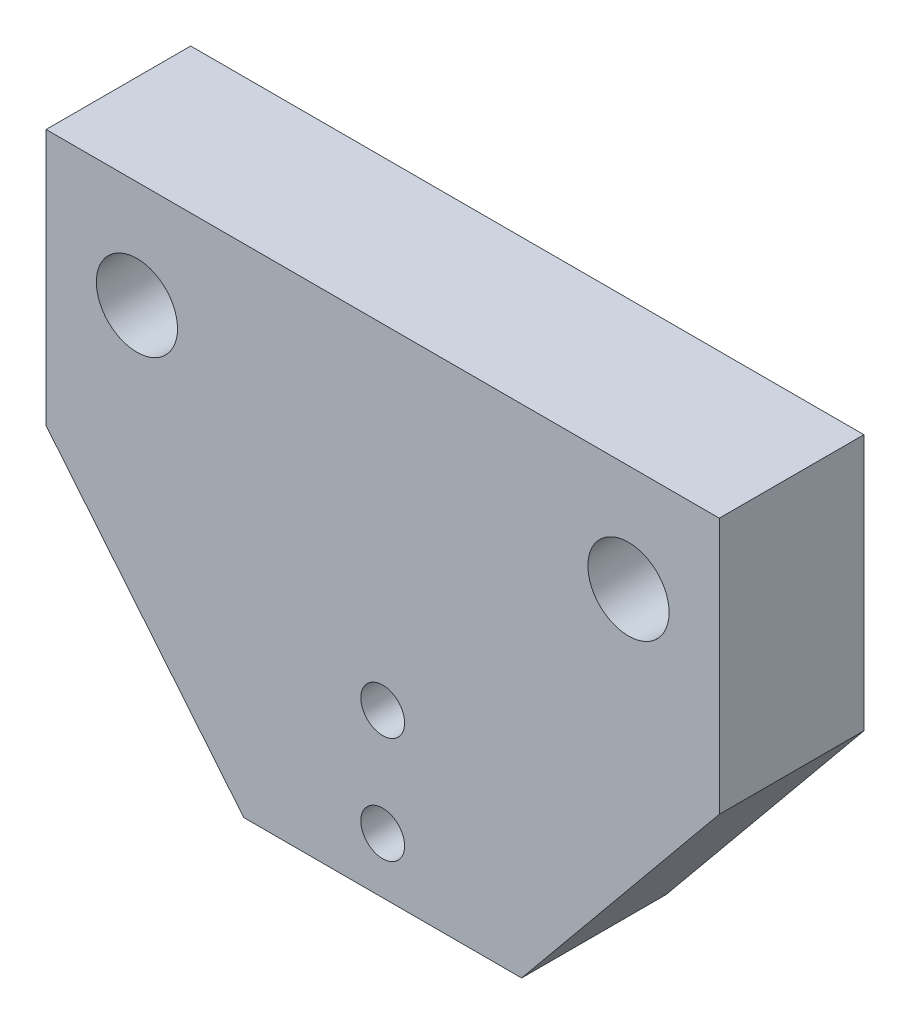
ISO-10303-21;
HEADER;
FILE_DESCRIPTION(('STEP AP214'),'2;1');
FILE_NAME('part.step','',(''),(''),'','','');
FILE_SCHEMA(('AUTOMOTIVE_DESIGN { 1 0 10303 214 1 1 1 1 }'));
ENDSEC;
DATA;
#1=APPLICATION_CONTEXT('core data for automotive mechanical design processes');
#2=APPLICATION_PROTOCOL_DEFINITION('international standard','automotive_design',2000,#1);
#3=PRODUCT_CONTEXT('',#1,'mechanical');
#4=PRODUCT('Part','Part','',(#3));
#5=PRODUCT_RELATED_PRODUCT_CATEGORY('part','',(#4));
#6=PRODUCT_DEFINITION_FORMATION('','',#4);
#7=PRODUCT_DEFINITION_CONTEXT('part definition',#1,'design');
#8=PRODUCT_DEFINITION('design','',#6,#7);
#9=PRODUCT_DEFINITION_SHAPE('','',#8);
#10=(LENGTH_UNIT() NAMED_UNIT(*) SI_UNIT(.MILLI.,.METRE.));
#11=(NAMED_UNIT(*) PLANE_ANGLE_UNIT() SI_UNIT($,.RADIAN.));
#12=(NAMED_UNIT(*) SI_UNIT($,.STERADIAN.) SOLID_ANGLE_UNIT());
#13=UNCERTAINTY_MEASURE_WITH_UNIT(LENGTH_MEASURE(1.E-05),#10,'distance_accuracy_value','');
#14=(GEOMETRIC_REPRESENTATION_CONTEXT(3) GLOBAL_UNCERTAINTY_ASSIGNED_CONTEXT((#13)) GLOBAL_UNIT_ASSIGNED_CONTEXT((#10,
#11,#12)) REPRESENTATION_CONTEXT('',''));
#15=CARTESIAN_POINT('',(0.,0.,0.));
#16=DIRECTION('',(0.,0.,1.));
#17=DIRECTION('',(1.,0.,0.));
#18=AXIS2_PLACEMENT_3D('',#15,#16,#17);
#19=CARTESIAN_POINT('',(0.,9.99999999999999,13.53));
#20=DIRECTION('',(0.,-1.,0.));
#21=DIRECTION('',(1.,0.,0.));
#22=AXIS2_PLACEMENT_3D('',#19,#20,#21);
#23=PLANE('',#22);
#24=DIRECTION('',(-1.,0.,0.));
#25=VECTOR('',#24,1.);
#26=CARTESIAN_POINT('',(0.,9.99999999999999,0.));
#27=LINE('',#26,#25);
#28=CARTESIAN_POINT('',(31.5,9.99999999999999,0.));
#29=VERTEX_POINT('',#28);
#30=CARTESIAN_POINT('',(-31.5,10.,0.));
#31=VERTEX_POINT('',#30);
#32=EDGE_CURVE('E130',#29,#31,#27,.T.);
#33=ORIENTED_EDGE('',*,*,#32,.T.);
#34=DIRECTION('',(0.,0.,-1.));
#35=VECTOR('',#34,1.);
#36=CARTESIAN_POINT('',(-31.5,10.,13.53));
#37=LINE('',#36,#35);
#38=CARTESIAN_POINT('',(-31.5,10.,13.53));
#39=VERTEX_POINT('',#38);
#40=EDGE_CURVE('E11',#39,#31,#37,.T.);
#41=ORIENTED_EDGE('',*,*,#40,.F.);
#42=DIRECTION('',(-1.,0.,0.));
#43=VECTOR('',#42,1.);
#44=CARTESIAN_POINT('',(0.,9.99999999999999,13.53));
#45=LINE('',#44,#43);
#46=CARTESIAN_POINT('',(31.5,9.99999999999999,13.53));
#47=VERTEX_POINT('',#46);
#48=EDGE_CURVE('E140',#47,#39,#45,.T.);
#49=ORIENTED_EDGE('',*,*,#48,.F.);
#50=DIRECTION('',(0.,0.,-1.));
#51=VECTOR('',#50,1.);
#52=CARTESIAN_POINT('',(31.5,9.99999999999999,13.53));
#53=LINE('',#52,#51);
#54=EDGE_CURVE('E62',#47,#29,#53,.T.);
#55=ORIENTED_EDGE('',*,*,#54,.T.);
#56=EDGE_LOOP('',(#33,#41,#49,#55));
#57=FACE_BOUND('',#56,.T.);
#58=ADVANCED_FACE('F45',(#57),#23,.F.);
#59=CARTESIAN_POINT('',(-31.5,0.,13.53));
#60=DIRECTION('',(1.,0.,0.));
#61=DIRECTION('',(0.,0.,-1.));
#62=AXIS2_PLACEMENT_3D('',#59,#60,#61);
#63=PLANE('',#62);
#64=DIRECTION('',(0.,-1.,0.));
#65=VECTOR('',#64,1.);
#66=CARTESIAN_POINT('',(-31.5,0.,0.));
#67=LINE('',#66,#65);
#68=CARTESIAN_POINT('',(-31.5,-14.,0.));
#69=VERTEX_POINT('',#68);
#70=EDGE_CURVE('E135',#31,#69,#67,.T.);
#71=ORIENTED_EDGE('',*,*,#70,.T.);
#72=DIRECTION('',(0.,0.,-1.));
#73=VECTOR('',#72,1.);
#74=CARTESIAN_POINT('',(-31.5,-14.,13.53));
#75=LINE('',#74,#73);
#76=CARTESIAN_POINT('',(-31.5,-14.,13.53));
#77=VERTEX_POINT('',#76);
#78=EDGE_CURVE('E54',#77,#69,#75,.T.);
#79=ORIENTED_EDGE('',*,*,#78,.F.);
#80=DIRECTION('',(0.,-1.,0.));
#81=VECTOR('',#80,1.);
#82=CARTESIAN_POINT('',(-31.5,0.,13.53));
#83=LINE('',#82,#81);
#84=EDGE_CURVE('E85',#39,#77,#83,.T.);
#85=ORIENTED_EDGE('',*,*,#84,.F.);
#86=ORIENTED_EDGE('',*,*,#40,.T.);
#87=EDGE_LOOP('',(#71,#79,#85,#86));
#88=FACE_BOUND('',#87,.T.);
#89=ADVANCED_FACE('F223',(#88),#63,.F.);
#90=CARTESIAN_POINT('',(-23.,0.,13.53));
#91=DIRECTION('',(0.,0.,-1.));
#92=DIRECTION('',(-1.,0.,0.));
#93=AXIS2_PLACEMENT_3D('',#90,#91,#92);
#94=CYLINDRICAL_SURFACE('',#93,3.8);
#95=CARTESIAN_POINT('',(-23.,0.,13.53));
#96=DIRECTION('',(0.,0.,1.));
#97=DIRECTION('',(1.,0.,0.));
#98=AXIS2_PLACEMENT_3D('',#95,#96,#97);
#99=CIRCLE('',#98,3.8);
#100=CARTESIAN_POINT('',(-19.2,0.,13.53));
#101=VERTEX_POINT('',#100);
#102=EDGE_CURVE('E149',#101,#101,#99,.T.);
#103=ORIENTED_EDGE('',*,*,#102,.T.);
#104=EDGE_LOOP('',(#103));
#105=FACE_BOUND('',#104,.T.);
#106=CARTESIAN_POINT('',(-23.,0.,0.));
#107=DIRECTION('',(0.,0.,1.));
#108=DIRECTION('',(1.,0.,0.));
#109=AXIS2_PLACEMENT_3D('',#106,#107,#108);
#110=CIRCLE('',#109,3.8);
#111=CARTESIAN_POINT('',(-19.2,0.,0.));
#112=VERTEX_POINT('',#111);
#113=EDGE_CURVE('E162',#112,#112,#110,.T.);
#114=ORIENTED_EDGE('',*,*,#113,.F.);
#115=EDGE_LOOP('',(#114));
#116=FACE_BOUND('',#115,.T.);
#117=ADVANCED_FACE('F227',(#105,#116),#94,.F.);
#118=CARTESIAN_POINT('',(31.5,0.,13.53));
#119=DIRECTION('',(1.,0.,0.));
#120=DIRECTION('',(0.,0.,-1.));
#121=AXIS2_PLACEMENT_3D('',#118,#119,#120);
#122=PLANE('',#121);
#123=DIRECTION('',(0.,-1.,0.));
#124=VECTOR('',#123,1.);
#125=CARTESIAN_POINT('',(31.5,0.,0.));
#126=LINE('',#125,#124);
#127=CARTESIAN_POINT('',(31.5,-14.,0.));
#128=VERTEX_POINT('',#127);
#129=EDGE_CURVE('E159',#29,#128,#126,.T.);
#130=ORIENTED_EDGE('',*,*,#129,.F.);
#131=ORIENTED_EDGE('',*,*,#54,.F.);
#132=DIRECTION('',(0.,-1.,0.));
#133=VECTOR('',#132,1.);
#134=CARTESIAN_POINT('',(31.5,0.,13.53));
#135=LINE('',#134,#133);
#136=CARTESIAN_POINT('',(31.5,-14.,13.53));
#137=VERTEX_POINT('',#136);
#138=EDGE_CURVE('E146',#47,#137,#135,.T.);
#139=ORIENTED_EDGE('',*,*,#138,.T.);
#140=DIRECTION('',(0.,0.,-1.));
#141=VECTOR('',#140,1.);
#142=CARTESIAN_POINT('',(31.5,-14.,13.53));
#143=LINE('',#142,#141);
#144=EDGE_CURVE('E74',#137,#128,#143,.T.);
#145=ORIENTED_EDGE('',*,*,#144,.T.);
#146=EDGE_LOOP('',(#130,#131,#139,#145));
#147=FACE_BOUND('',#146,.T.);
#148=ADVANCED_FACE('F218',(#147),#122,.T.);
#149=CARTESIAN_POINT('',(23.,0.,13.53));
#150=DIRECTION('',(0.,0.,-1.));
#151=DIRECTION('',(-1.,0.,0.));
#152=AXIS2_PLACEMENT_3D('',#149,#150,#151);
#153=CYLINDRICAL_SURFACE('',#152,3.8);
#154=CARTESIAN_POINT('',(23.,0.,13.53));
#155=DIRECTION('',(0.,0.,1.));
#156=DIRECTION('',(1.,0.,0.));
#157=AXIS2_PLACEMENT_3D('',#154,#155,#156);
#158=CIRCLE('',#157,3.8);
#159=CARTESIAN_POINT('',(26.8,0.,13.53));
#160=VERTEX_POINT('',#159);
#161=EDGE_CURVE('E153',#160,#160,#158,.F.);
#162=ORIENTED_EDGE('',*,*,#161,.F.);
#163=EDGE_LOOP('',(#162));
#164=FACE_BOUND('',#163,.T.);
#165=CARTESIAN_POINT('',(23.,0.,0.));
#166=DIRECTION('',(0.,0.,1.));
#167=DIRECTION('',(1.,0.,0.));
#168=AXIS2_PLACEMENT_3D('',#165,#166,#167);
#169=CIRCLE('',#168,3.8);
#170=CARTESIAN_POINT('',(26.8,0.,0.));
#171=VERTEX_POINT('',#170);
#172=EDGE_CURVE('E143',#171,#171,#169,.F.);
#173=ORIENTED_EDGE('',*,*,#172,.T.);
#174=EDGE_LOOP('',(#173));
#175=FACE_BOUND('',#174,.T.);
#176=ADVANCED_FACE('F211',(#164,#175),#153,.F.);
#177=CARTESIAN_POINT('',(0.,0.,13.53));
#178=DIRECTION('',(0.,0.,1.));
#179=DIRECTION('',(1.,0.,0.));
#180=AXIS2_PLACEMENT_3D('',#177,#178,#179);
#181=PLANE('',#180);
#182=ORIENTED_EDGE('',*,*,#48,.T.);
#183=ORIENTED_EDGE('',*,*,#84,.T.);
#184=DIRECTION('',(-0.63484159071382,0.772642320029098,0.));
#185=VECTOR('',#184,1.);
#186=CARTESIAN_POINT('',(-25.6718255860496,-21.0932564384535,13.53));
#187=LINE('',#186,#185);
#188=CARTESIAN_POINT('',(-13.,-36.5156686795933,13.53));
#189=VERTEX_POINT('',#188);
#190=EDGE_CURVE('E114',#189,#77,#187,.T.);
#191=ORIENTED_EDGE('',*,*,#190,.F.);
#192=DIRECTION('',(1.,0.,0.));
#193=VECTOR('',#192,1.);
#194=CARTESIAN_POINT('',(0.,-36.5156686795933,13.53));
#195=LINE('',#194,#193);
#196=CARTESIAN_POINT('',(13.,-36.5156686795933,13.53));
#197=VERTEX_POINT('',#196);
#198=EDGE_CURVE('E115',#189,#197,#195,.T.);
#199=ORIENTED_EDGE('',*,*,#198,.T.);
#200=DIRECTION('',(0.63484159071382,0.772642320029098,0.));
#201=VECTOR('',#200,1.);
#202=CARTESIAN_POINT('',(25.6718255860496,-21.0932564384535,13.53));
#203=LINE('',#202,#201);
#204=EDGE_CURVE('E104',#197,#137,#203,.T.);
#205=ORIENTED_EDGE('',*,*,#204,.T.);
#206=ORIENTED_EDGE('',*,*,#138,.F.);
#207=EDGE_LOOP('',(#182,#183,#191,#199,#205,#206));
#208=FACE_BOUND('',#207,.T.);
#209=ORIENTED_EDGE('',*,*,#102,.F.);
#210=EDGE_LOOP('',(#209));
#211=FACE_BOUND('',#210,.T.);
#212=ORIENTED_EDGE('',*,*,#161,.T.);
#213=EDGE_LOOP('',(#212));
#214=FACE_BOUND('',#213,.T.);
#215=CARTESIAN_POINT('',(0.,-31.2999555570793,13.53));
#216=DIRECTION('',(0.,0.,1.));
#217=DIRECTION('',(1.,0.,0.));
#218=AXIS2_PLACEMENT_3D('',#215,#216,#217);
#219=CIRCLE('',#218,2.05);
#220=CARTESIAN_POINT('',(2.05,-31.2999555570793,13.53));
#221=VERTEX_POINT('',#220);
#222=EDGE_CURVE('E183',#221,#221,#219,.T.);
#223=ORIENTED_EDGE('',*,*,#222,.F.);
#224=EDGE_LOOP('',(#223));
#225=FACE_BOUND('',#224,.T.);
#226=CARTESIAN_POINT('',(0.,-21.3220695835742,13.53));
#227=DIRECTION('',(0.,0.,1.));
#228=DIRECTION('',(1.,0.,0.));
#229=AXIS2_PLACEMENT_3D('',#226,#227,#228);
#230=CIRCLE('',#229,2.05);
#231=CARTESIAN_POINT('',(2.05,-21.3220695835742,13.53));
#232=VERTEX_POINT('',#231);
#233=EDGE_CURVE('E124',#232,#232,#230,.T.);
#234=ORIENTED_EDGE('',*,*,#233,.F.);
#235=EDGE_LOOP('',(#234));
#236=FACE_BOUND('',#235,.T.);
#237=ADVANCED_FACE('F119',(#208,#211,#214,#225,#236),#181,.T.);
#238=CARTESIAN_POINT('',(0.,0.,0.));
#239=DIRECTION('',(0.,0.,1.));
#240=DIRECTION('',(1.,0.,0.));
#241=AXIS2_PLACEMENT_3D('',#238,#239,#240);
#242=PLANE('',#241);
#243=ORIENTED_EDGE('',*,*,#32,.F.);
#244=ORIENTED_EDGE('',*,*,#129,.T.);
#245=DIRECTION('',(0.63484159071382,0.772642320029098,0.));
#246=VECTOR('',#245,1.);
#247=CARTESIAN_POINT('',(25.6718255860496,-21.0932564384535,0.));
#248=LINE('',#247,#246);
#249=CARTESIAN_POINT('',(13.,-36.5156686795933,0.));
#250=VERTEX_POINT('',#249);
#251=EDGE_CURVE('E184',#250,#128,#248,.T.);
#252=ORIENTED_EDGE('',*,*,#251,.F.);
#253=DIRECTION('',(1.,0.,0.));
#254=VECTOR('',#253,1.);
#255=CARTESIAN_POINT('',(0.,-36.5156686795933,0.));
#256=LINE('',#255,#254);
#257=CARTESIAN_POINT('',(-13.,-36.5156686795933,0.));
#258=VERTEX_POINT('',#257);
#259=EDGE_CURVE('E128',#258,#250,#256,.T.);
#260=ORIENTED_EDGE('',*,*,#259,.F.);
#261=DIRECTION('',(-0.63484159071382,0.772642320029098,0.));
#262=VECTOR('',#261,1.);
#263=CARTESIAN_POINT('',(-25.6718255860496,-21.0932564384535,0.));
#264=LINE('',#263,#262);
#265=EDGE_CURVE('E178',#258,#69,#264,.T.);
#266=ORIENTED_EDGE('',*,*,#265,.T.);
#267=ORIENTED_EDGE('',*,*,#70,.F.);
#268=EDGE_LOOP('',(#243,#244,#252,#260,#266,#267));
#269=FACE_BOUND('',#268,.T.);
#270=ORIENTED_EDGE('',*,*,#113,.T.);
#271=EDGE_LOOP('',(#270));
#272=FACE_BOUND('',#271,.T.);
#273=ORIENTED_EDGE('',*,*,#172,.F.);
#274=EDGE_LOOP('',(#273));
#275=FACE_BOUND('',#274,.T.);
#276=CARTESIAN_POINT('',(0.,-31.2999555570793,0.));
#277=DIRECTION('',(0.,0.,1.));
#278=DIRECTION('',(1.,0.,0.));
#279=AXIS2_PLACEMENT_3D('',#276,#277,#278);
#280=CIRCLE('',#279,2.05);
#281=CARTESIAN_POINT('',(2.05,-31.2999555570793,0.));
#282=VERTEX_POINT('',#281);
#283=EDGE_CURVE('E197',#282,#282,#280,.T.);
#284=ORIENTED_EDGE('',*,*,#283,.T.);
#285=EDGE_LOOP('',(#284));
#286=FACE_BOUND('',#285,.T.);
#287=CARTESIAN_POINT('',(0.,-21.3220695835742,0.));
#288=DIRECTION('',(0.,0.,1.));
#289=DIRECTION('',(1.,0.,0.));
#290=AXIS2_PLACEMENT_3D('',#287,#288,#289);
#291=CIRCLE('',#290,2.05);
#292=CARTESIAN_POINT('',(2.05,-21.3220695835742,0.));
#293=VERTEX_POINT('',#292);
#294=EDGE_CURVE('E193',#293,#293,#291,.T.);
#295=ORIENTED_EDGE('',*,*,#294,.T.);
#296=EDGE_LOOP('',(#295));
#297=FACE_BOUND('',#296,.T.);
#298=ADVANCED_FACE('F180',(#269,#272,#275,#286,#297),#242,.F.);
#299=CARTESIAN_POINT('',(0.,-36.5156686795933,13.53));
#300=DIRECTION('',(0.,1.,0.));
#301=DIRECTION('',(0.,0.,1.));
#302=AXIS2_PLACEMENT_3D('',#299,#300,#301);
#303=PLANE('',#302);
#304=ORIENTED_EDGE('',*,*,#259,.T.);
#305=DIRECTION('',(0.,0.,-1.));
#306=VECTOR('',#305,1.);
#307=CARTESIAN_POINT('',(13.,-36.5156686795933,13.53));
#308=LINE('',#307,#306);
#309=EDGE_CURVE('E109',#197,#250,#308,.T.);
#310=ORIENTED_EDGE('',*,*,#309,.F.);
#311=ORIENTED_EDGE('',*,*,#198,.F.);
#312=DIRECTION('',(0.,0.,-1.));
#313=VECTOR('',#312,1.);
#314=CARTESIAN_POINT('',(-13.,-36.5156686795933,13.53));
#315=LINE('',#314,#313);
#316=EDGE_CURVE('E131',#189,#258,#315,.T.);
#317=ORIENTED_EDGE('',*,*,#316,.T.);
#318=EDGE_LOOP('',(#304,#310,#311,#317));
#319=FACE_BOUND('',#318,.T.);
#320=ADVANCED_FACE('F126',(#319),#303,.F.);
#321=CARTESIAN_POINT('',(25.6718255860496,-21.0932564384535,13.53));
#322=DIRECTION('',(-0.772642320029098,0.63484159071382,0.));
#323=DIRECTION('',(-0.63484159071382,-0.772642320029098,0.));
#324=AXIS2_PLACEMENT_3D('',#321,#322,#323);
#325=PLANE('',#324);
#326=ORIENTED_EDGE('',*,*,#251,.T.);
#327=ORIENTED_EDGE('',*,*,#144,.F.);
#328=ORIENTED_EDGE('',*,*,#204,.F.);
#329=ORIENTED_EDGE('',*,*,#309,.T.);
#330=EDGE_LOOP('',(#326,#327,#328,#329));
#331=FACE_BOUND('',#330,.T.);
#332=ADVANCED_FACE('F107',(#331),#325,.F.);
#333=CARTESIAN_POINT('',(0.,-21.3220695835742,13.53));
#334=DIRECTION('',(0.,0.,-1.));
#335=DIRECTION('',(-1.,0.,0.));
#336=AXIS2_PLACEMENT_3D('',#333,#334,#335);
#337=CYLINDRICAL_SURFACE('',#336,2.05);
#338=ORIENTED_EDGE('',*,*,#233,.T.);
#339=EDGE_LOOP('',(#338));
#340=FACE_BOUND('',#339,.T.);
#341=ORIENTED_EDGE('',*,*,#294,.F.);
#342=EDGE_LOOP('',(#341));
#343=FACE_BOUND('',#342,.T.);
#344=ADVANCED_FACE('F207',(#340,#343),#337,.F.);
#345=CARTESIAN_POINT('',(0.,-31.2999555570793,13.53));
#346=DIRECTION('',(0.,0.,-1.));
#347=DIRECTION('',(-1.,0.,0.));
#348=AXIS2_PLACEMENT_3D('',#345,#346,#347);
#349=CYLINDRICAL_SURFACE('',#348,2.05);
#350=ORIENTED_EDGE('',*,*,#222,.T.);
#351=EDGE_LOOP('',(#350));
#352=FACE_BOUND('',#351,.T.);
#353=ORIENTED_EDGE('',*,*,#283,.F.);
#354=EDGE_LOOP('',(#353));
#355=FACE_BOUND('',#354,.T.);
#356=ADVANCED_FACE('F248',(#352,#355),#349,.F.);
#357=CARTESIAN_POINT('',(-25.6718255860496,-21.0932564384535,13.53));
#358=DIRECTION('',(-0.772642320029098,-0.63484159071382,0.));
#359=DIRECTION('',(0.63484159071382,-0.772642320029098,0.));
#360=AXIS2_PLACEMENT_3D('',#357,#358,#359);
#361=PLANE('',#360);
#362=ORIENTED_EDGE('',*,*,#265,.F.);
#363=ORIENTED_EDGE('',*,*,#316,.F.);
#364=ORIENTED_EDGE('',*,*,#190,.T.);
#365=ORIENTED_EDGE('',*,*,#78,.T.);
#366=EDGE_LOOP('',(#362,#363,#364,#365));
#367=FACE_BOUND('',#366,.T.);
#368=ADVANCED_FACE('F177',(#367),#361,.T.);
#369=CLOSED_SHELL('',(#58,#89,#117,#148,#176,#237,#298,#320,#332,#344,#356,#368));
#370=MANIFOLD_SOLID_BREP('B2',#369);
#371=ADVANCED_BREP_SHAPE_REPRESENTATION('',(#18,#370),#14);
#372=SHAPE_DEFINITION_REPRESENTATION(#9,#371);
ENDSEC;
END-ISO-10303-21;
